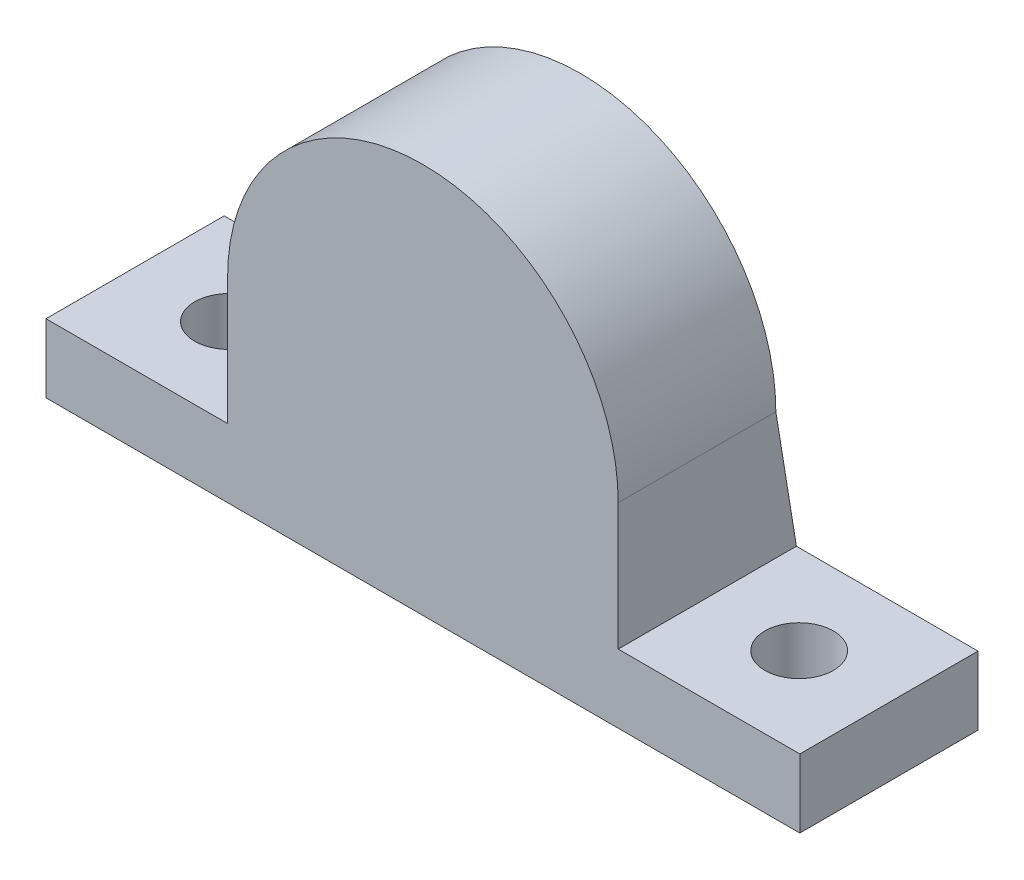
ISO-10303-21;
HEADER;
FILE_DESCRIPTION(('STEP AP214'),'2;1');
FILE_NAME('part.step','',(''),(''),'','','');
FILE_SCHEMA(('AUTOMOTIVE_DESIGN { 1 0 10303 214 1 1 1 1 }'));
ENDSEC;
DATA;
#1=APPLICATION_CONTEXT('core data for automotive mechanical design processes');
#2=APPLICATION_PROTOCOL_DEFINITION('international standard','automotive_design',2000,#1);
#3=PRODUCT_CONTEXT('',#1,'mechanical');
#4=PRODUCT('Part','Part','',(#3));
#5=PRODUCT_RELATED_PRODUCT_CATEGORY('part','',(#4));
#6=PRODUCT_DEFINITION_FORMATION('','',#4);
#7=PRODUCT_DEFINITION_CONTEXT('part definition',#1,'design');
#8=PRODUCT_DEFINITION('design','',#6,#7);
#9=PRODUCT_DEFINITION_SHAPE('','',#8);
#10=(LENGTH_UNIT() NAMED_UNIT(*) SI_UNIT(.MILLI.,.METRE.));
#11=(NAMED_UNIT(*) PLANE_ANGLE_UNIT() SI_UNIT($,.RADIAN.));
#12=(NAMED_UNIT(*) SI_UNIT($,.STERADIAN.) SOLID_ANGLE_UNIT());
#13=UNCERTAINTY_MEASURE_WITH_UNIT(LENGTH_MEASURE(1.E-05),#10,'distance_accuracy_value','');
#14=(GEOMETRIC_REPRESENTATION_CONTEXT(3) GLOBAL_UNCERTAINTY_ASSIGNED_CONTEXT((#13)) GLOBAL_UNIT_ASSIGNED_CONTEXT((#10,
#11,#12)) REPRESENTATION_CONTEXT('',''));
#15=CARTESIAN_POINT('',(0.,0.,0.));
#16=DIRECTION('',(0.,0.,1.));
#17=DIRECTION('',(1.,0.,0.));
#18=AXIS2_PLACEMENT_3D('',#15,#16,#17);
#19=CARTESIAN_POINT('',(0.,14.25,6.5));
#20=DIRECTION('',(0.,0.,-1.));
#21=DIRECTION('',(-1.,0.,0.));
#22=AXIS2_PLACEMENT_3D('',#19,#20,#21);
#23=CYLINDRICAL_SURFACE('',#22,14.25);
#24=CARTESIAN_POINT('',(0.,14.25,6.5));
#25=DIRECTION('',(0.,0.,1.));
#26=DIRECTION('',(1.,0.,0.));
#27=AXIS2_PLACEMENT_3D('',#24,#25,#26);
#28=CIRCLE('',#27,14.25);
#29=CARTESIAN_POINT('',(14.25,14.25,6.5));
#30=VERTEX_POINT('',#29);
#31=CARTESIAN_POINT('',(-14.25,14.25,6.5));
#32=VERTEX_POINT('',#31);
#33=EDGE_CURVE('E376',#30,#32,#28,.T.);
#34=ORIENTED_EDGE('',*,*,#33,.F.);
#35=DIRECTION('',(0.,0.,-1.));
#36=VECTOR('',#35,1.);
#37=CARTESIAN_POINT('',(14.25,14.25,6.5));
#38=LINE('',#37,#36);
#39=CARTESIAN_POINT('',(14.25,14.25,-5.));
#40=VERTEX_POINT('',#39);
#41=EDGE_CURVE('E168',#30,#40,#38,.T.);
#42=ORIENTED_EDGE('',*,*,#41,.T.);
#43=CARTESIAN_POINT('',(0.,14.25,-5.));
#44=DIRECTION('',(0.,0.,1.));
#45=DIRECTION('',(1.,0.,0.));
#46=AXIS2_PLACEMENT_3D('',#43,#44,#45);
#47=CIRCLE('',#46,14.25);
#48=CARTESIAN_POINT('',(-14.25,14.25,-5.));
#49=VERTEX_POINT('',#48);
#50=EDGE_CURVE('E290',#40,#49,#47,.T.);
#51=ORIENTED_EDGE('',*,*,#50,.T.);
#52=DIRECTION('',(0.,0.,-1.));
#53=VECTOR('',#52,1.);
#54=CARTESIAN_POINT('',(-14.25,14.25,6.5));
#55=LINE('',#54,#53);
#56=EDGE_CURVE('E317',#32,#49,#55,.T.);
#57=ORIENTED_EDGE('',*,*,#56,.F.);
#58=EDGE_LOOP('',(#34,#42,#51,#57));
#59=FACE_BOUND('',#58,.T.);
#60=ADVANCED_FACE('F42',(#59),#23,.T.);
#61=CARTESIAN_POINT('',(0.,14.25,-5.));
#62=DIRECTION('',(0.,0.,-1.));
#63=DIRECTION('',(-1.,0.,0.));
#64=AXIS2_PLACEMENT_3D('',#61,#62,#63);
#65=CIRCLE('',#64,14.25);
#66=CARTESIAN_POINT('',(10.8397416943394,5.,-5.));
#67=VERTEX_POINT('',#66);
#68=CARTESIAN_POINT('',(-10.8397416943394,5.,-5.));
#69=VERTEX_POINT('',#68);
#70=EDGE_CURVE('E387',#67,#69,#65,.T.);
#71=ORIENTED_EDGE('',*,*,#70,.F.);
#72=DIRECTION('',(0.,0.,1.));
#73=VECTOR('',#72,1.);
#74=CARTESIAN_POINT('',(10.8397416943394,5.,-6.50000000000001));
#75=LINE('',#74,#73);
#76=CARTESIAN_POINT('',(10.8397416943394,5.,-1.5));
#77=VERTEX_POINT('',#76);
#78=EDGE_CURVE('E294',#67,#77,#75,.T.);
#79=ORIENTED_EDGE('',*,*,#78,.T.);
#80=CARTESIAN_POINT('',(0.,14.25,-1.5));
#81=DIRECTION('',(0.,0.,1.));
#82=DIRECTION('',(1.,0.,0.));
#83=AXIS2_PLACEMENT_3D('',#80,#81,#82);
#84=CIRCLE('',#83,14.25);
#85=CARTESIAN_POINT('',(0.,0.,-1.5));
#86=VERTEX_POINT('',#85);
#87=EDGE_CURVE('E233',#77,#86,#84,.F.);
#88=ORIENTED_EDGE('',*,*,#87,.T.);
#89=CARTESIAN_POINT('',(-10.8397416943394,5.,-1.5));
#90=VERTEX_POINT('',#89);
#91=EDGE_CURVE('E66',#86,#90,#84,.F.);
#92=ORIENTED_EDGE('',*,*,#91,.T.);
#93=DIRECTION('',(0.,0.,1.));
#94=VECTOR('',#93,1.);
#95=CARTESIAN_POINT('',(-10.8397416943394,5.,-6.50000000000001));
#96=LINE('',#95,#94);
#97=EDGE_CURVE('E298',#69,#90,#96,.T.);
#98=ORIENTED_EDGE('',*,*,#97,.F.);
#99=EDGE_LOOP('',(#71,#79,#88,#92,#98));
#100=FACE_BOUND('',#99,.T.);
#101=ADVANCED_FACE('F417',(#100),#23,.T.);
#102=CARTESIAN_POINT('',(0.,14.25,-5.5));
#103=DIRECTION('',(0.,0.,-1.));
#104=DIRECTION('',(-1.,0.,0.));
#105=AXIS2_PLACEMENT_3D('',#102,#103,#104);
#106=CYLINDRICAL_SURFACE('',#105,12.);
#107=CARTESIAN_POINT('',(0.,14.25,-3.5));
#108=DIRECTION('',(0.,0.,-1.));
#109=DIRECTION('',(-1.,0.,0.));
#110=AXIS2_PLACEMENT_3D('',#107,#108,#109);
#111=CIRCLE('',#110,12.);
#112=CARTESIAN_POINT('',(-12.,14.25,-3.5));
#113=VERTEX_POINT('',#112);
#114=EDGE_CURVE('E277',#113,#113,#111,.T.);
#115=ORIENTED_EDGE('',*,*,#114,.F.);
#116=EDGE_LOOP('',(#115));
#117=FACE_BOUND('',#116,.T.);
#118=CARTESIAN_POINT('',(0.,14.25,-5.));
#119=DIRECTION('',(0.,0.,-1.));
#120=DIRECTION('',(-1.,0.,0.));
#121=AXIS2_PLACEMENT_3D('',#118,#119,#120);
#122=CIRCLE('',#121,12.);
#123=CARTESIAN_POINT('',(-12.,14.25,-5.));
#124=VERTEX_POINT('',#123);
#125=CARTESIAN_POINT('',(12.,14.25,-5.));
#126=VERTEX_POINT('',#125);
#127=EDGE_CURVE('E250',#124,#126,#122,.F.);
#128=ORIENTED_EDGE('',*,*,#127,.F.);
#129=CARTESIAN_POINT('',(0.,14.25,-5.));
#130=DIRECTION('',(0.,0.,-1.));
#131=DIRECTION('',(-1.,0.,0.));
#132=AXIS2_PLACEMENT_3D('',#129,#130,#131);
#133=CIRCLE('',#132,12.);
#134=EDGE_CURVE('E262',#124,#126,#133,.T.);
#135=ORIENTED_EDGE('',*,*,#134,.T.);
#136=EDGE_LOOP('',(#128,#135));
#137=FACE_BOUND('',#136,.T.);
#138=ADVANCED_FACE('F260',(#117,#137),#106,.F.);
#139=CARTESIAN_POINT('',(-10.8397416943394,5.,-6.50000000000001));
#140=DIRECTION('',(0.,-1.,0.));
#141=DIRECTION('',(0.,0.,-1.));
#142=AXIS2_PLACEMENT_3D('',#139,#140,#141);
#143=PLANE('',#142);
#144=DIRECTION('',(0.,0.,1.));
#145=VECTOR('',#144,1.);
#146=CARTESIAN_POINT('',(-12.6491228070175,5.,6.5));
#147=LINE('',#146,#145);
#148=CARTESIAN_POINT('',(-12.6491228070175,5.,-5.));
#149=VERTEX_POINT('',#148);
#150=CARTESIAN_POINT('',(-12.6491228070175,5.,-1.5));
#151=VERTEX_POINT('',#150);
#152=EDGE_CURVE('E58',#149,#151,#147,.T.);
#153=ORIENTED_EDGE('',*,*,#152,.F.);
#154=DIRECTION('',(1.,0.,0.));
#155=VECTOR('',#154,1.);
#156=CARTESIAN_POINT('',(-10.8397416943394,5.,-5.));
#157=LINE('',#156,#155);
#158=EDGE_CURVE('E253',#149,#69,#157,.T.);
#159=ORIENTED_EDGE('',*,*,#158,.T.);
#160=ORIENTED_EDGE('',*,*,#97,.T.);
#161=DIRECTION('',(1.,0.,0.));
#162=VECTOR('',#161,1.);
#163=CARTESIAN_POINT('',(-13.,5.,-1.5));
#164=LINE('',#163,#162);
#165=EDGE_CURVE('E328',#151,#90,#164,.T.);
#166=ORIENTED_EDGE('',*,*,#165,.F.);
#167=EDGE_LOOP('',(#153,#159,#160,#166));
#168=FACE_BOUND('',#167,.T.);
#169=ADVANCED_FACE('F432',(#168),#143,.T.);
#170=CARTESIAN_POINT('',(12.6491228070175,5.,-6.50000000000001));
#171=DIRECTION('',(0.,-1.,0.));
#172=DIRECTION('',(1.,0.,0.));
#173=AXIS2_PLACEMENT_3D('',#170,#171,#172);
#174=PLANE('',#173);
#175=ORIENTED_EDGE('',*,*,#78,.F.);
#176=DIRECTION('',(1.,0.,0.));
#177=VECTOR('',#176,1.);
#178=CARTESIAN_POINT('',(12.6491228070175,5.,-5.));
#179=LINE('',#178,#177);
#180=CARTESIAN_POINT('',(12.6491228070175,5.,-5.));
#181=VERTEX_POINT('',#180);
#182=EDGE_CURVE('E255',#67,#181,#179,.T.);
#183=ORIENTED_EDGE('',*,*,#182,.T.);
#184=DIRECTION('',(0.,0.,1.));
#185=VECTOR('',#184,1.);
#186=CARTESIAN_POINT('',(12.6491228070175,5.,-6.50000000000001));
#187=LINE('',#186,#185);
#188=CARTESIAN_POINT('',(12.6491228070175,5.,-1.5));
#189=VERTEX_POINT('',#188);
#190=EDGE_CURVE('E295',#181,#189,#187,.T.);
#191=ORIENTED_EDGE('',*,*,#190,.T.);
#192=EDGE_CURVE('E323',#77,#189,#164,.T.);
#193=ORIENTED_EDGE('',*,*,#192,.F.);
#194=EDGE_LOOP('',(#175,#183,#191,#193));
#195=FACE_BOUND('',#194,.T.);
#196=ADVANCED_FACE('F411',(#195),#174,.T.);
#197=CARTESIAN_POINT('',(-21.75,14.25,-5.));
#198=DIRECTION('',(0.,-0.160071158553663,0.987105477747585));
#199=DIRECTION('',(0.,-0.987105477747585,-0.160071158553663));
#200=AXIS2_PLACEMENT_3D('',#197,#198,#199);
#201=PLANE('',#200);
#202=DIRECTION('',(0.0691049612721484,-0.984745698128108,-0.159688491588342));
#203=VECTOR('',#202,1.);
#204=CARTESIAN_POINT('',(11.8388270210556,16.5467149499569,-4.62755973784482));
#205=LINE('',#204,#203);
#206=CARTESIAN_POINT('',(12.6491228070175,5.,-6.5));
#207=VERTEX_POINT('',#206);
#208=EDGE_CURVE('E11',#126,#207,#205,.T.);
#209=ORIENTED_EDGE('',*,*,#208,.F.);
#210=DIRECTION('',(-1.,0.,0.));
#211=VECTOR('',#210,1.);
#212=CARTESIAN_POINT('',(14.25,14.25,-5.));
#213=LINE('',#212,#211);
#214=EDGE_CURVE('E276',#40,#126,#213,.T.);
#215=ORIENTED_EDGE('',*,*,#214,.F.);
#216=DIRECTION('',(0.,-0.987105477747585,-0.160071158553662));
#217=VECTOR('',#216,1.);
#218=CARTESIAN_POINT('',(14.25,14.25,-5.));
#219=LINE('',#218,#217);
#220=CARTESIAN_POINT('',(14.25,5.,-6.5));
#221=VERTEX_POINT('',#220);
#222=EDGE_CURVE('E265',#40,#221,#219,.T.);
#223=ORIENTED_EDGE('',*,*,#222,.T.);
#224=DIRECTION('',(1.,0.,0.));
#225=VECTOR('',#224,1.);
#226=CARTESIAN_POINT('',(-21.75,5.,-6.5));
#227=LINE('',#226,#225);
#228=EDGE_CURVE('E394',#207,#221,#227,.T.);
#229=ORIENTED_EDGE('',*,*,#228,.F.);
#230=EDGE_LOOP('',(#209,#215,#223,#229));
#231=FACE_BOUND('',#230,.T.);
#232=ADVANCED_FACE('F404',(#231),#201,.F.);
#233=DIRECTION('',(0.0691049612721472,0.984745698128108,0.159688491588342));
#234=VECTOR('',#233,1.);
#235=CARTESIAN_POINT('',(-12.0465610828061,13.5865045700124,-5.10759385351149));
#236=LINE('',#235,#234);
#237=CARTESIAN_POINT('',(-12.6491228070175,5.,-6.5));
#238=VERTEX_POINT('',#237);
#239=EDGE_CURVE('E51',#238,#124,#236,.T.);
#240=ORIENTED_EDGE('',*,*,#239,.F.);
#241=CARTESIAN_POINT('',(-14.25,5.,-6.5));
#242=VERTEX_POINT('',#241);
#243=EDGE_CURVE('E286',#242,#238,#227,.T.);
#244=ORIENTED_EDGE('',*,*,#243,.F.);
#245=DIRECTION('',(0.,-0.987105477747585,-0.160071158553663));
#246=VECTOR('',#245,1.);
#247=CARTESIAN_POINT('',(-14.25,16.0670818505338,-4.70533807829181));
#248=LINE('',#247,#246);
#249=EDGE_CURVE('E271',#49,#242,#248,.T.);
#250=ORIENTED_EDGE('',*,*,#249,.F.);
#251=EDGE_CURVE('E268',#124,#49,#213,.T.);
#252=ORIENTED_EDGE('',*,*,#251,.F.);
#253=EDGE_LOOP('',(#240,#244,#250,#252));
#254=FACE_BOUND('',#253,.T.);
#255=ADVANCED_FACE('F269',(#254),#201,.F.);
#256=CARTESIAN_POINT('',(-27.5,5.,-6.5));
#257=DIRECTION('',(0.,0.,1.));
#258=DIRECTION('',(1.,0.,0.));
#259=AXIS2_PLACEMENT_3D('',#256,#257,#258);
#260=PLANE('',#259);
#261=DIRECTION('',(-1.,0.,0.));
#262=VECTOR('',#261,1.);
#263=CARTESIAN_POINT('',(-27.5,5.,-6.5));
#264=LINE('',#263,#262);
#265=CARTESIAN_POINT('',(-27.5,5.,-6.5));
#266=VERTEX_POINT('',#265);
#267=EDGE_CURVE('E354',#242,#266,#264,.T.);
#268=ORIENTED_EDGE('',*,*,#267,.F.);
#269=ORIENTED_EDGE('',*,*,#243,.T.);
#270=DIRECTION('',(0.0700032814807302,0.997546761100416,0.));
#271=VECTOR('',#270,1.);
#272=CARTESIAN_POINT('',(-12.,14.25,-6.5));
#273=LINE('',#272,#271);
#274=CARTESIAN_POINT('',(-13.,0.,-6.5));
#275=VERTEX_POINT('',#274);
#276=EDGE_CURVE('E242',#275,#238,#273,.T.);
#277=ORIENTED_EDGE('',*,*,#276,.F.);
#278=DIRECTION('',(-1.,0.,0.));
#279=VECTOR('',#278,1.);
#280=CARTESIAN_POINT('',(-27.5,0.,-6.5));
#281=LINE('',#280,#279);
#282=CARTESIAN_POINT('',(-27.5,0.,-6.5));
#283=VERTEX_POINT('',#282);
#284=EDGE_CURVE('E204',#275,#283,#281,.T.);
#285=ORIENTED_EDGE('',*,*,#284,.T.);
#286=DIRECTION('',(0.,-1.,0.));
#287=VECTOR('',#286,1.);
#288=CARTESIAN_POINT('',(-27.5,5.,-6.5));
#289=LINE('',#288,#287);
#290=EDGE_CURVE('E223',#266,#283,#289,.T.);
#291=ORIENTED_EDGE('',*,*,#290,.F.);
#292=EDGE_LOOP('',(#268,#269,#277,#285,#291));
#293=FACE_BOUND('',#292,.T.);
#294=ADVANCED_FACE('F365',(#293),#260,.F.);
#295=CARTESIAN_POINT('',(-27.5,5.,6.5));
#296=DIRECTION('',(0.,0.,-1.));
#297=DIRECTION('',(-1.,0.,0.));
#298=AXIS2_PLACEMENT_3D('',#295,#296,#297);
#299=PLANE('',#298);
#300=DIRECTION('',(0.,1.,0.));
#301=VECTOR('',#300,1.);
#302=CARTESIAN_POINT('',(14.25,0.,6.5));
#303=LINE('',#302,#301);
#304=CARTESIAN_POINT('',(14.25,4.99999999999999,6.5));
#305=VERTEX_POINT('',#304);
#306=EDGE_CURVE('E161',#305,#30,#303,.T.);
#307=ORIENTED_EDGE('',*,*,#306,.T.);
#308=ORIENTED_EDGE('',*,*,#33,.T.);
#309=DIRECTION('',(0.,1.,0.));
#310=VECTOR('',#309,1.);
#311=CARTESIAN_POINT('',(-14.25,0.,6.5));
#312=LINE('',#311,#310);
#313=CARTESIAN_POINT('',(-14.25,5.,6.5));
#314=VERTEX_POINT('',#313);
#315=EDGE_CURVE('E173',#314,#32,#312,.T.);
#316=ORIENTED_EDGE('',*,*,#315,.F.);
#317=DIRECTION('',(1.,0.,0.));
#318=VECTOR('',#317,1.);
#319=CARTESIAN_POINT('',(-27.5,5.,6.5));
#320=LINE('',#319,#318);
#321=CARTESIAN_POINT('',(-27.5,5.,6.5));
#322=VERTEX_POINT('',#321);
#323=EDGE_CURVE('E191',#322,#314,#320,.T.);
#324=ORIENTED_EDGE('',*,*,#323,.F.);
#325=DIRECTION('',(0.,-1.,0.));
#326=VECTOR('',#325,1.);
#327=CARTESIAN_POINT('',(-27.5,5.,6.5));
#328=LINE('',#327,#326);
#329=CARTESIAN_POINT('',(-27.5,0.,6.5));
#330=VERTEX_POINT('',#329);
#331=EDGE_CURVE('E219',#322,#330,#328,.T.);
#332=ORIENTED_EDGE('',*,*,#331,.T.);
#333=DIRECTION('',(1.,0.,0.));
#334=VECTOR('',#333,1.);
#335=CARTESIAN_POINT('',(-27.5,0.,6.5));
#336=LINE('',#335,#334);
#337=CARTESIAN_POINT('',(27.5,0.,6.5));
#338=VERTEX_POINT('',#337);
#339=EDGE_CURVE('E213',#330,#338,#336,.T.);
#340=ORIENTED_EDGE('',*,*,#339,.T.);
#341=DIRECTION('',(0.,-1.,0.));
#342=VECTOR('',#341,1.);
#343=CARTESIAN_POINT('',(27.5,5.,6.5));
#344=LINE('',#343,#342);
#345=CARTESIAN_POINT('',(27.5,5.,6.5));
#346=VERTEX_POINT('',#345);
#347=EDGE_CURVE('E188',#346,#338,#344,.T.);
#348=ORIENTED_EDGE('',*,*,#347,.F.);
#349=EDGE_CURVE('E180',#305,#346,#320,.T.);
#350=ORIENTED_EDGE('',*,*,#349,.F.);
#351=EDGE_LOOP('',(#307,#308,#316,#324,#332,#340,#348,#350));
#352=FACE_BOUND('',#351,.T.);
#353=ADVANCED_FACE('F186',(#352),#299,.F.);
#354=CARTESIAN_POINT('',(-12.,14.25,6.5));
#355=DIRECTION('',(-0.997546761100416,0.0700032814807302,0.));
#356=DIRECTION('',(-0.0700032814807302,-0.997546761100416,0.));
#357=AXIS2_PLACEMENT_3D('',#354,#355,#356);
#358=PLANE('',#357);
#359=ORIENTED_EDGE('',*,*,#276,.T.);
#360=ORIENTED_EDGE('',*,*,#239,.T.);
#361=DIRECTION('',(0.0700032814807301,0.997546761100416,0.));
#362=VECTOR('',#361,1.);
#363=CARTESIAN_POINT('',(-13.,0.,-5.));
#364=LINE('',#363,#362);
#365=EDGE_CURVE('E239',#149,#124,#364,.T.);
#366=ORIENTED_EDGE('',*,*,#365,.F.);
#367=ORIENTED_EDGE('',*,*,#152,.T.);
#368=DIRECTION('',(-0.0700032814807302,-0.997546761100416,0.));
#369=VECTOR('',#368,1.);
#370=CARTESIAN_POINT('',(-13.,0.,-1.5));
#371=LINE('',#370,#369);
#372=CARTESIAN_POINT('',(-13.,0.,-1.5));
#373=VERTEX_POINT('',#372);
#374=EDGE_CURVE('E320',#151,#373,#371,.T.);
#375=ORIENTED_EDGE('',*,*,#374,.T.);
#376=DIRECTION('',(0.,0.,1.));
#377=VECTOR('',#376,1.);
#378=CARTESIAN_POINT('',(-13.,0.,-6.5));
#379=LINE('',#378,#377);
#380=EDGE_CURVE('E324',#275,#373,#379,.T.);
#381=ORIENTED_EDGE('',*,*,#380,.F.);
#382=EDGE_LOOP('',(#359,#360,#366,#367,#375,#381));
#383=FACE_BOUND('',#382,.T.);
#384=ADVANCED_FACE('F238',(#383),#358,.F.);
#385=CARTESIAN_POINT('',(0.,5.,0.));
#386=DIRECTION('',(0.,1.,0.));
#387=DIRECTION('',(0.,0.,1.));
#388=AXIS2_PLACEMENT_3D('',#385,#386,#387);
#389=PLANE('',#388);
#390=CARTESIAN_POINT('',(20.95,5.,0.));
#391=DIRECTION('',(0.,1.,0.));
#392=DIRECTION('',(0.,0.,1.));
#393=AXIS2_PLACEMENT_3D('',#390,#391,#392);
#394=CIRCLE('',#393,2.5);
#395=CARTESIAN_POINT('',(20.95,5.,2.5));
#396=VERTEX_POINT('',#395);
#397=EDGE_CURVE('E336',#396,#396,#394,.T.);
#398=ORIENTED_EDGE('',*,*,#397,.F.);
#399=EDGE_LOOP('',(#398));
#400=FACE_BOUND('',#399,.T.);
#401=CARTESIAN_POINT('',(27.5,5.,-6.5));
#402=VERTEX_POINT('',#401);
#403=EDGE_CURVE('E182',#402,#221,#264,.T.);
#404=ORIENTED_EDGE('',*,*,#403,.T.);
#405=DIRECTION('',(0.,0.,-1.));
#406=VECTOR('',#405,1.);
#407=CARTESIAN_POINT('',(14.25,5.,6.5));
#408=LINE('',#407,#406);
#409=EDGE_CURVE('E165',#305,#221,#408,.T.);
#410=ORIENTED_EDGE('',*,*,#409,.F.);
#411=ORIENTED_EDGE('',*,*,#349,.T.);
#412=DIRECTION('',(0.,0.,-1.));
#413=VECTOR('',#412,1.);
#414=CARTESIAN_POINT('',(27.5,5.,-6.5));
#415=LINE('',#414,#413);
#416=EDGE_CURVE('E216',#346,#402,#415,.T.);
#417=ORIENTED_EDGE('',*,*,#416,.T.);
#418=EDGE_LOOP('',(#404,#410,#411,#417));
#419=FACE_BOUND('',#418,.T.);
#420=ADVANCED_FACE('F178',(#400,#419),#389,.T.);
#421=CARTESIAN_POINT('',(-13.,0.,-1.5));
#422=DIRECTION('',(0.,0.,1.));
#423=DIRECTION('',(1.,0.,0.));
#424=AXIS2_PLACEMENT_3D('',#421,#422,#423);
#425=PLANE('',#424);
#426=DIRECTION('',(-0.0700032814807311,0.997546761100416,0.));
#427=VECTOR('',#426,1.);
#428=CARTESIAN_POINT('',(12.8725880551302,1.8156202143951,-1.5));
#429=LINE('',#428,#427);
#430=CARTESIAN_POINT('',(13.,0.,-1.5));
#431=VERTEX_POINT('',#430);
#432=EDGE_CURVE('E184',#431,#189,#429,.T.);
#433=ORIENTED_EDGE('',*,*,#432,.F.);
#434=DIRECTION('',(1.,0.,0.));
#435=VECTOR('',#434,1.);
#436=CARTESIAN_POINT('',(-13.,0.,-1.5));
#437=LINE('',#436,#435);
#438=EDGE_CURVE('E327',#86,#431,#437,.T.);
#439=ORIENTED_EDGE('',*,*,#438,.F.);
#440=ORIENTED_EDGE('',*,*,#87,.F.);
#441=ORIENTED_EDGE('',*,*,#192,.T.);
#442=EDGE_LOOP('',(#433,#439,#440,#441));
#443=FACE_BOUND('',#442,.T.);
#444=ADVANCED_FACE('F421',(#443),#425,.F.);
#445=CARTESIAN_POINT('',(-20.65,5.,0.));
#446=DIRECTION('',(0.,1.,0.));
#447=DIRECTION('',(0.,0.,1.));
#448=AXIS2_PLACEMENT_3D('',#445,#446,#447);
#449=CIRCLE('',#448,2.5);
#450=CARTESIAN_POINT('',(-20.65,5.,2.5));
#451=VERTEX_POINT('',#450);
#452=EDGE_CURVE('E342',#451,#451,#449,.T.);
#453=ORIENTED_EDGE('',*,*,#452,.F.);
#454=EDGE_LOOP('',(#453));
#455=FACE_BOUND('',#454,.T.);
#456=ORIENTED_EDGE('',*,*,#323,.T.);
#457=DIRECTION('',(0.,0.,-1.));
#458=VECTOR('',#457,1.);
#459=CARTESIAN_POINT('',(-14.25,5.,6.5));
#460=LINE('',#459,#458);
#461=EDGE_CURVE('E314',#314,#242,#460,.T.);
#462=ORIENTED_EDGE('',*,*,#461,.T.);
#463=ORIENTED_EDGE('',*,*,#267,.T.);
#464=DIRECTION('',(0.,0.,1.));
#465=VECTOR('',#464,1.);
#466=CARTESIAN_POINT('',(-27.5,5.,-6.5));
#467=LINE('',#466,#465);
#468=EDGE_CURVE('E192',#266,#322,#467,.T.);
#469=ORIENTED_EDGE('',*,*,#468,.T.);
#470=EDGE_LOOP('',(#456,#462,#463,#469));
#471=FACE_BOUND('',#470,.T.);
#472=ADVANCED_FACE('F360',(#455,#471),#389,.T.);
#473=ORIENTED_EDGE('',*,*,#374,.F.);
#474=ORIENTED_EDGE('',*,*,#165,.T.);
#475=ORIENTED_EDGE('',*,*,#91,.F.);
#476=EDGE_CURVE('E329',#373,#86,#437,.T.);
#477=ORIENTED_EDGE('',*,*,#476,.F.);
#478=EDGE_LOOP('',(#473,#474,#475,#477));
#479=FACE_BOUND('',#478,.T.);
#480=ADVANCED_FACE('F429',(#479),#425,.F.);
#481=CARTESIAN_POINT('',(27.5,5.,-6.5));
#482=DIRECTION('',(-1.,0.,0.));
#483=DIRECTION('',(0.,0.,1.));
#484=AXIS2_PLACEMENT_3D('',#481,#482,#483);
#485=PLANE('',#484);
#486=DIRECTION('',(0.,0.,-1.));
#487=VECTOR('',#486,1.);
#488=CARTESIAN_POINT('',(27.5,0.,-6.5));
#489=LINE('',#488,#487);
#490=CARTESIAN_POINT('',(27.5,0.,-6.5));
#491=VERTEX_POINT('',#490);
#492=EDGE_CURVE('E200',#338,#491,#489,.T.);
#493=ORIENTED_EDGE('',*,*,#492,.T.);
#494=DIRECTION('',(0.,-1.,0.));
#495=VECTOR('',#494,1.);
#496=CARTESIAN_POINT('',(27.5,5.,-6.5));
#497=LINE('',#496,#495);
#498=EDGE_CURVE('E227',#402,#491,#497,.T.);
#499=ORIENTED_EDGE('',*,*,#498,.F.);
#500=ORIENTED_EDGE('',*,*,#416,.F.);
#501=ORIENTED_EDGE('',*,*,#347,.T.);
#502=EDGE_LOOP('',(#493,#499,#500,#501));
#503=FACE_BOUND('',#502,.T.);
#504=ADVANCED_FACE('F44',(#503),#485,.F.);
#505=DIRECTION('',(0.0700032814807311,-0.997546761100416,0.));
#506=VECTOR('',#505,1.);
#507=CARTESIAN_POINT('',(12.,14.25,-6.5));
#508=LINE('',#507,#506);
#509=CARTESIAN_POINT('',(13.,0.,-6.5));
#510=VERTEX_POINT('',#509);
#511=EDGE_CURVE('E303',#207,#510,#508,.T.);
#512=ORIENTED_EDGE('',*,*,#511,.F.);
#513=ORIENTED_EDGE('',*,*,#228,.T.);
#514=ORIENTED_EDGE('',*,*,#403,.F.);
#515=ORIENTED_EDGE('',*,*,#498,.T.);
#516=EDGE_CURVE('E206',#491,#510,#281,.T.);
#517=ORIENTED_EDGE('',*,*,#516,.T.);
#518=EDGE_LOOP('',(#512,#513,#514,#515,#517));
#519=FACE_BOUND('',#518,.T.);
#520=ADVANCED_FACE('F401',(#519),#260,.F.);
#521=CARTESIAN_POINT('',(-27.5,5.,-6.5));
#522=DIRECTION('',(1.,0.,0.));
#523=DIRECTION('',(0.,0.,-1.));
#524=AXIS2_PLACEMENT_3D('',#521,#522,#523);
#525=PLANE('',#524);
#526=DIRECTION('',(0.,0.,1.));
#527=VECTOR('',#526,1.);
#528=CARTESIAN_POINT('',(-27.5,0.,-6.5));
#529=LINE('',#528,#527);
#530=EDGE_CURVE('E210',#283,#330,#529,.T.);
#531=ORIENTED_EDGE('',*,*,#530,.T.);
#532=ORIENTED_EDGE('',*,*,#331,.F.);
#533=ORIENTED_EDGE('',*,*,#468,.F.);
#534=ORIENTED_EDGE('',*,*,#290,.T.);
#535=EDGE_LOOP('',(#531,#532,#533,#534));
#536=FACE_BOUND('',#535,.T.);
#537=ADVANCED_FACE('F368',(#536),#525,.F.);
#538=CARTESIAN_POINT('',(0.,0.,0.));
#539=DIRECTION('',(0.,1.,0.));
#540=DIRECTION('',(0.,0.,1.));
#541=AXIS2_PLACEMENT_3D('',#538,#539,#540);
#542=PLANE('',#541);
#543=ORIENTED_EDGE('',*,*,#492,.F.);
#544=ORIENTED_EDGE('',*,*,#339,.F.);
#545=ORIENTED_EDGE('',*,*,#530,.F.);
#546=ORIENTED_EDGE('',*,*,#284,.F.);
#547=ORIENTED_EDGE('',*,*,#380,.T.);
#548=ORIENTED_EDGE('',*,*,#476,.T.);
#549=ORIENTED_EDGE('',*,*,#438,.T.);
#550=DIRECTION('',(0.,0.,-1.));
#551=VECTOR('',#550,1.);
#552=CARTESIAN_POINT('',(13.,0.,-6.50000000000002));
#553=LINE('',#552,#551);
#554=EDGE_CURVE('E333',#431,#510,#553,.T.);
#555=ORIENTED_EDGE('',*,*,#554,.T.);
#556=ORIENTED_EDGE('',*,*,#516,.F.);
#557=EDGE_LOOP('',(#543,#544,#545,#546,#547,#548,#549,#555,#556));
#558=FACE_BOUND('',#557,.T.);
#559=CARTESIAN_POINT('',(-20.65,0.,0.));
#560=DIRECTION('',(0.,1.,0.));
#561=DIRECTION('',(0.,0.,1.));
#562=AXIS2_PLACEMENT_3D('',#559,#560,#561);
#563=CIRCLE('',#562,2.5);
#564=CARTESIAN_POINT('',(-20.65,0.,2.5));
#565=VERTEX_POINT('',#564);
#566=EDGE_CURVE('E205',#565,#565,#563,.T.);
#567=ORIENTED_EDGE('',*,*,#566,.T.);
#568=EDGE_LOOP('',(#567));
#569=FACE_BOUND('',#568,.T.);
#570=CARTESIAN_POINT('',(20.95,0.,0.));
#571=DIRECTION('',(0.,1.,0.));
#572=DIRECTION('',(0.,0.,1.));
#573=AXIS2_PLACEMENT_3D('',#570,#571,#572);
#574=CIRCLE('',#573,2.5);
#575=CARTESIAN_POINT('',(20.95,0.,2.5));
#576=VERTEX_POINT('',#575);
#577=EDGE_CURVE('E346',#576,#576,#574,.T.);
#578=ORIENTED_EDGE('',*,*,#577,.T.);
#579=EDGE_LOOP('',(#578));
#580=FACE_BOUND('',#579,.T.);
#581=ADVANCED_FACE('F427',(#558,#569,#580),#542,.F.);
#582=CARTESIAN_POINT('',(20.95,0.,0.));
#583=DIRECTION('',(0.,1.,0.));
#584=DIRECTION('',(0.,0.,1.));
#585=AXIS2_PLACEMENT_3D('',#582,#583,#584);
#586=CYLINDRICAL_SURFACE('',#585,2.5);
#587=ORIENTED_EDGE('',*,*,#577,.F.);
#588=EDGE_LOOP('',(#587));
#589=FACE_BOUND('',#588,.T.);
#590=ORIENTED_EDGE('',*,*,#397,.T.);
#591=EDGE_LOOP('',(#590));
#592=FACE_BOUND('',#591,.T.);
#593=ADVANCED_FACE('F455',(#589,#592),#586,.F.);
#594=CARTESIAN_POINT('',(-20.65,0.,0.));
#595=DIRECTION('',(0.,1.,0.));
#596=DIRECTION('',(0.,0.,1.));
#597=AXIS2_PLACEMENT_3D('',#594,#595,#596);
#598=CYLINDRICAL_SURFACE('',#597,2.5);
#599=ORIENTED_EDGE('',*,*,#566,.F.);
#600=EDGE_LOOP('',(#599));
#601=FACE_BOUND('',#600,.T.);
#602=ORIENTED_EDGE('',*,*,#452,.T.);
#603=EDGE_LOOP('',(#602));
#604=FACE_BOUND('',#603,.T.);
#605=ADVANCED_FACE('F452',(#601,#604),#598,.F.);
#606=CARTESIAN_POINT('',(-14.25,14.25,6.5));
#607=DIRECTION('',(1.,0.,0.));
#608=DIRECTION('',(0.,1.,0.));
#609=AXIS2_PLACEMENT_3D('',#606,#607,#608);
#610=PLANE('',#609);
#611=ORIENTED_EDGE('',*,*,#461,.F.);
#612=ORIENTED_EDGE('',*,*,#315,.T.);
#613=ORIENTED_EDGE('',*,*,#56,.T.);
#614=ORIENTED_EDGE('',*,*,#249,.T.);
#615=EDGE_LOOP('',(#611,#612,#613,#614));
#616=FACE_BOUND('',#615,.T.);
#617=ADVANCED_FACE('F373',(#616),#610,.F.);
#618=CARTESIAN_POINT('',(12.,14.25,6.5));
#619=DIRECTION('',(0.997546761100416,0.0700032814807311,0.));
#620=DIRECTION('',(-0.0700032814807311,0.997546761100416,0.));
#621=AXIS2_PLACEMENT_3D('',#618,#619,#620);
#622=PLANE('',#621);
#623=ORIENTED_EDGE('',*,*,#511,.T.);
#624=ORIENTED_EDGE('',*,*,#554,.F.);
#625=ORIENTED_EDGE('',*,*,#432,.T.);
#626=ORIENTED_EDGE('',*,*,#190,.F.);
#627=DIRECTION('',(0.0700032814807313,-0.997546761100415,0.));
#628=VECTOR('',#627,1.);
#629=CARTESIAN_POINT('',(12.,14.25,-5.));
#630=LINE('',#629,#628);
#631=EDGE_CURVE('E256',#126,#181,#630,.T.);
#632=ORIENTED_EDGE('',*,*,#631,.F.);
#633=ORIENTED_EDGE('',*,*,#208,.T.);
#634=EDGE_LOOP('',(#623,#624,#625,#626,#632,#633));
#635=FACE_BOUND('',#634,.T.);
#636=ADVANCED_FACE('F406',(#635),#622,.F.);
#637=CARTESIAN_POINT('',(14.25,14.25,6.5));
#638=DIRECTION('',(-1.,0.,0.));
#639=DIRECTION('',(0.,0.,1.));
#640=AXIS2_PLACEMENT_3D('',#637,#638,#639);
#641=PLANE('',#640);
#642=ORIENTED_EDGE('',*,*,#409,.T.);
#643=ORIENTED_EDGE('',*,*,#222,.F.);
#644=ORIENTED_EDGE('',*,*,#41,.F.);
#645=ORIENTED_EDGE('',*,*,#306,.F.);
#646=EDGE_LOOP('',(#642,#643,#644,#645));
#647=FACE_BOUND('',#646,.T.);
#648=ADVANCED_FACE('F163',(#647),#641,.F.);
#649=CARTESIAN_POINT('',(0.,0.,-5.));
#650=DIRECTION('',(0.,0.,1.));
#651=DIRECTION('',(1.,0.,0.));
#652=AXIS2_PLACEMENT_3D('',#649,#650,#651);
#653=PLANE('',#652);
#654=ORIENTED_EDGE('',*,*,#214,.T.);
#655=ORIENTED_EDGE('',*,*,#134,.F.);
#656=ORIENTED_EDGE('',*,*,#251,.T.);
#657=ORIENTED_EDGE('',*,*,#50,.F.);
#658=EDGE_LOOP('',(#654,#655,#656,#657));
#659=FACE_BOUND('',#658,.T.);
#660=ADVANCED_FACE('F279',(#659),#653,.F.);
#661=CARTESIAN_POINT('',(0.,14.25,-3.5));
#662=DIRECTION('',(0.,0.,-1.));
#663=DIRECTION('',(-1.,0.,0.));
#664=AXIS2_PLACEMENT_3D('',#661,#662,#663);
#665=PLANE('',#664);
#666=CARTESIAN_POINT('',(0.,14.25,-3.5));
#667=DIRECTION('',(0.,0.,-1.));
#668=DIRECTION('',(-1.,0.,0.));
#669=AXIS2_PLACEMENT_3D('',#666,#667,#668);
#670=CIRCLE('',#669,11.25);
#671=CARTESIAN_POINT('',(-11.25,14.25,-3.5));
#672=VERTEX_POINT('',#671);
#673=EDGE_CURVE('E707',#672,#672,#670,.T.);
#674=ORIENTED_EDGE('',*,*,#673,.F.);
#675=EDGE_LOOP('',(#674));
#676=FACE_BOUND('',#675,.T.);
#677=ORIENTED_EDGE('',*,*,#114,.T.);
#678=EDGE_LOOP('',(#677));
#679=FACE_BOUND('',#678,.T.);
#680=ADVANCED_FACE('F484',(#676,#679),#665,.T.);
#681=CARTESIAN_POINT('',(0.,0.,-5.));
#682=DIRECTION('',(0.,0.,-1.));
#683=DIRECTION('',(-1.,0.,0.));
#684=AXIS2_PLACEMENT_3D('',#681,#682,#683);
#685=PLANE('',#684);
#686=ORIENTED_EDGE('',*,*,#127,.T.);
#687=ORIENTED_EDGE('',*,*,#631,.T.);
#688=ORIENTED_EDGE('',*,*,#182,.F.);
#689=ORIENTED_EDGE('',*,*,#70,.T.);
#690=ORIENTED_EDGE('',*,*,#158,.F.);
#691=ORIENTED_EDGE('',*,*,#365,.T.);
#692=EDGE_LOOP('',(#686,#687,#688,#689,#690,#691));
#693=FACE_BOUND('',#692,.T.);
#694=ADVANCED_FACE('F249',(#693),#685,.T.);
#695=CARTESIAN_POINT('',(0.,14.25,35.3198051533946));
#696=DIRECTION('',(0.,0.,-1.));
#697=DIRECTION('',(-1.,0.,0.));
#698=AXIS2_PLACEMENT_3D('',#695,#696,#697);
#699=CYLINDRICAL_SURFACE('',#698,11.25);
#700=ORIENTED_EDGE('',*,*,#673,.T.);
#701=EDGE_LOOP('',(#700));
#702=FACE_BOUND('',#701,.T.);
#703=CARTESIAN_POINT('',(0.,14.25,3.5));
#704=DIRECTION('',(0.,0.,1.));
#705=DIRECTION('',(1.,0.,0.));
#706=AXIS2_PLACEMENT_3D('',#703,#704,#705);
#707=CIRCLE('',#706,11.25);
#708=CARTESIAN_POINT('',(11.25,14.25,3.5));
#709=VERTEX_POINT('',#708);
#710=EDGE_CURVE('E174',#709,#709,#707,.F.);
#711=ORIENTED_EDGE('',*,*,#710,.F.);
#712=EDGE_LOOP('',(#711));
#713=FACE_BOUND('',#712,.T.);
#714=ADVANCED_FACE('F622',(#702,#713),#699,.F.);
#715=CARTESIAN_POINT('',(0.,14.25,3.5));
#716=DIRECTION('',(0.,0.,1.));
#717=DIRECTION('',(1.,0.,0.));
#718=AXIS2_PLACEMENT_3D('',#715,#716,#717);
#719=PLANE('',#718);
#720=ORIENTED_EDGE('',*,*,#710,.T.);
#721=EDGE_LOOP('',(#720));
#722=FACE_BOUND('',#721,.T.);
#723=ADVANCED_FACE('F624',(#722),#719,.F.);
#724=CLOSED_SHELL('',(#60,#101,#138,#169,#196,#232,#255,#294,#353,#384,#420,#444,#472,#480,#504,
#520,#537,#581,#593,#605,#617,#636,#648,#660,#680,#694,#714,#723));
#725=MANIFOLD_SOLID_BREP('B2',#724);
#726=ADVANCED_BREP_SHAPE_REPRESENTATION('',(#18,#725),#14);
#727=SHAPE_DEFINITION_REPRESENTATION(#9,#726);
ENDSEC;
END-ISO-10303-21;
